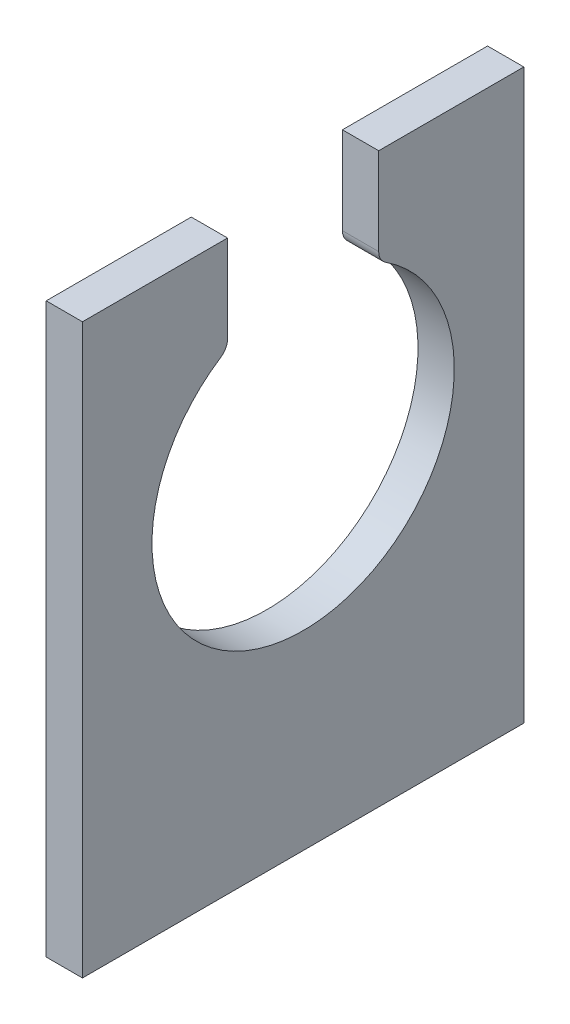
ISO-10303-21;
HEADER;
FILE_DESCRIPTION(('STEP AP214'),'2;1');
FILE_NAME('part.step','',(''),(''),'','','');
FILE_SCHEMA(('AUTOMOTIVE_DESIGN { 1 0 10303 214 1 1 1 1 }'));
ENDSEC;
DATA;
#1=APPLICATION_CONTEXT('core data for automotive mechanical design processes');
#2=APPLICATION_PROTOCOL_DEFINITION('international standard','automotive_design',2000,#1);
#3=PRODUCT_CONTEXT('',#1,'mechanical');
#4=PRODUCT('Part','Part','',(#3));
#5=PRODUCT_RELATED_PRODUCT_CATEGORY('part','',(#4));
#6=PRODUCT_DEFINITION_FORMATION('','',#4);
#7=PRODUCT_DEFINITION_CONTEXT('part definition',#1,'design');
#8=PRODUCT_DEFINITION('design','',#6,#7);
#9=PRODUCT_DEFINITION_SHAPE('','',#8);
#10=(LENGTH_UNIT() NAMED_UNIT(*) SI_UNIT(.MILLI.,.METRE.));
#11=(NAMED_UNIT(*) PLANE_ANGLE_UNIT() SI_UNIT($,.RADIAN.));
#12=(NAMED_UNIT(*) SI_UNIT($,.STERADIAN.) SOLID_ANGLE_UNIT());
#13=UNCERTAINTY_MEASURE_WITH_UNIT(LENGTH_MEASURE(1.E-05),#10,'distance_accuracy_value','');
#14=(GEOMETRIC_REPRESENTATION_CONTEXT(3) GLOBAL_UNCERTAINTY_ASSIGNED_CONTEXT((#13)) GLOBAL_UNIT_ASSIGNED_CONTEXT((#10,
#11,#12)) REPRESENTATION_CONTEXT('',''));
#15=CARTESIAN_POINT('',(0.,0.,0.));
#16=DIRECTION('',(0.,0.,1.));
#17=DIRECTION('',(1.,0.,0.));
#18=AXIS2_PLACEMENT_3D('',#15,#16,#17);
#19=CARTESIAN_POINT('',(12.,94.,73.));
#20=DIRECTION('',(0.,0.,-1.));
#21=DIRECTION('',(0.,1.,0.));
#22=AXIS2_PLACEMENT_3D('',#19,#20,#21);
#23=PLANE('',#22);
#24=DIRECTION('',(0.,-1.,0.));
#25=VECTOR('',#24,1.);
#26=CARTESIAN_POINT('',(0.,94.,73.));
#27=LINE('',#26,#25);
#28=CARTESIAN_POINT('',(0.,94.,73.));
#29=VERTEX_POINT('',#28);
#30=CARTESIAN_POINT('',(0.,-94.,73.));
#31=VERTEX_POINT('',#30);
#32=EDGE_CURVE('E145',#29,#31,#27,.T.);
#33=ORIENTED_EDGE('',*,*,#32,.T.);
#34=DIRECTION('',(-1.,0.,0.));
#35=VECTOR('',#34,1.);
#36=CARTESIAN_POINT('',(12.,-94.,73.));
#37=LINE('',#36,#35);
#38=CARTESIAN_POINT('',(12.,-94.,73.));
#39=VERTEX_POINT('',#38);
#40=EDGE_CURVE('E11',#39,#31,#37,.T.);
#41=ORIENTED_EDGE('',*,*,#40,.F.);
#42=DIRECTION('',(0.,-1.,0.));
#43=VECTOR('',#42,1.);
#44=CARTESIAN_POINT('',(12.,94.,73.));
#45=LINE('',#44,#43);
#46=CARTESIAN_POINT('',(12.,94.,73.));
#47=VERTEX_POINT('',#46);
#48=EDGE_CURVE('E163',#47,#39,#45,.T.);
#49=ORIENTED_EDGE('',*,*,#48,.F.);
#50=DIRECTION('',(-1.,0.,0.));
#51=VECTOR('',#50,1.);
#52=CARTESIAN_POINT('',(12.,94.,73.));
#53=LINE('',#52,#51);
#54=EDGE_CURVE('E141',#47,#29,#53,.T.);
#55=ORIENTED_EDGE('',*,*,#54,.T.);
#56=EDGE_LOOP('',(#33,#41,#49,#55));
#57=FACE_BOUND('',#56,.T.);
#58=ADVANCED_FACE('F37',(#57),#23,.F.);
#59=CARTESIAN_POINT('',(12.,-94.,-73.));
#60=DIRECTION('',(0.,1.,0.));
#61=DIRECTION('',(0.,0.,1.));
#62=AXIS2_PLACEMENT_3D('',#59,#60,#61);
#63=PLANE('',#62);
#64=DIRECTION('',(0.,0.,-1.));
#65=VECTOR('',#64,1.);
#66=CARTESIAN_POINT('',(0.,-94.,-73.));
#67=LINE('',#66,#65);
#68=CARTESIAN_POINT('',(0.,-94.,-73.));
#69=VERTEX_POINT('',#68);
#70=EDGE_CURVE('E148',#31,#69,#67,.T.);
#71=ORIENTED_EDGE('',*,*,#70,.T.);
#72=DIRECTION('',(-1.,0.,0.));
#73=VECTOR('',#72,1.);
#74=CARTESIAN_POINT('',(12.,-94.,-73.));
#75=LINE('',#74,#73);
#76=CARTESIAN_POINT('',(12.,-94.,-73.));
#77=VERTEX_POINT('',#76);
#78=EDGE_CURVE('E45',#77,#69,#75,.T.);
#79=ORIENTED_EDGE('',*,*,#78,.F.);
#80=DIRECTION('',(0.,0.,-1.));
#81=VECTOR('',#80,1.);
#82=CARTESIAN_POINT('',(12.,-94.,-73.));
#83=LINE('',#82,#81);
#84=EDGE_CURVE('E102',#39,#77,#83,.T.);
#85=ORIENTED_EDGE('',*,*,#84,.F.);
#86=ORIENTED_EDGE('',*,*,#40,.T.);
#87=EDGE_LOOP('',(#71,#79,#85,#86));
#88=FACE_BOUND('',#87,.T.);
#89=ADVANCED_FACE('F212',(#88),#63,.F.);
#90=CARTESIAN_POINT('',(12.,94.,-73.));
#91=DIRECTION('',(0.,0.,1.));
#92=DIRECTION('',(0.,-1.,0.));
#93=AXIS2_PLACEMENT_3D('',#90,#91,#92);
#94=PLANE('',#93);
#95=DIRECTION('',(0.,1.,0.));
#96=VECTOR('',#95,1.);
#97=CARTESIAN_POINT('',(0.,94.,-73.));
#98=LINE('',#97,#96);
#99=CARTESIAN_POINT('',(0.,94.,-73.));
#100=VERTEX_POINT('',#99);
#101=EDGE_CURVE('E150',#69,#100,#98,.T.);
#102=ORIENTED_EDGE('',*,*,#101,.T.);
#103=DIRECTION('',(-1.,0.,0.));
#104=VECTOR('',#103,1.);
#105=CARTESIAN_POINT('',(12.,94.,-73.));
#106=LINE('',#105,#104);
#107=CARTESIAN_POINT('',(12.,94.,-73.));
#108=VERTEX_POINT('',#107);
#109=EDGE_CURVE('E176',#108,#100,#106,.T.);
#110=ORIENTED_EDGE('',*,*,#109,.F.);
#111=DIRECTION('',(0.,1.,0.));
#112=VECTOR('',#111,1.);
#113=CARTESIAN_POINT('',(12.,94.,-73.));
#114=LINE('',#113,#112);
#115=EDGE_CURVE('E184',#77,#108,#114,.T.);
#116=ORIENTED_EDGE('',*,*,#115,.F.);
#117=ORIENTED_EDGE('',*,*,#78,.T.);
#118=EDGE_LOOP('',(#102,#110,#116,#117));
#119=FACE_BOUND('',#118,.T.);
#120=ADVANCED_FACE('F182',(#119),#94,.F.);
#121=CARTESIAN_POINT('',(12.,94.,-73.));
#122=DIRECTION('',(0.,-1.,0.));
#123=DIRECTION('',(0.,0.,-1.));
#124=AXIS2_PLACEMENT_3D('',#121,#122,#123);
#125=PLANE('',#124);
#126=DIRECTION('',(0.,0.,1.));
#127=VECTOR('',#126,1.);
#128=CARTESIAN_POINT('',(0.,94.,-73.));
#129=LINE('',#128,#127);
#130=CARTESIAN_POINT('',(0.,94.,-25.));
#131=VERTEX_POINT('',#130);
#132=EDGE_CURVE('E152',#100,#131,#129,.T.);
#133=ORIENTED_EDGE('',*,*,#132,.T.);
#134=DIRECTION('',(-1.,0.,0.));
#135=VECTOR('',#134,1.);
#136=CARTESIAN_POINT('',(12.,94.,-25.));
#137=LINE('',#136,#135);
#138=CARTESIAN_POINT('',(12.,94.,-25.));
#139=VERTEX_POINT('',#138);
#140=EDGE_CURVE('E173',#139,#131,#137,.T.);
#141=ORIENTED_EDGE('',*,*,#140,.F.);
#142=DIRECTION('',(0.,0.,1.));
#143=VECTOR('',#142,1.);
#144=CARTESIAN_POINT('',(12.,94.,-73.));
#145=LINE('',#144,#143);
#146=EDGE_CURVE('E202',#108,#139,#145,.T.);
#147=ORIENTED_EDGE('',*,*,#146,.F.);
#148=ORIENTED_EDGE('',*,*,#109,.T.);
#149=EDGE_LOOP('',(#133,#141,#147,#148));
#150=FACE_BOUND('',#149,.T.);
#151=ADVANCED_FACE('F193',(#150),#125,.F.);
#152=CARTESIAN_POINT('',(12.,94.,-25.));
#153=DIRECTION('',(0.,0.,-1.));
#154=DIRECTION('',(0.,1.,0.));
#155=AXIS2_PLACEMENT_3D('',#152,#153,#154);
#156=PLANE('',#155);
#157=DIRECTION('',(0.,-1.,0.));
#158=VECTOR('',#157,1.);
#159=CARTESIAN_POINT('',(0.,94.,-25.));
#160=LINE('',#159,#158);
#161=CARTESIAN_POINT('',(0.,65.0977222864644,-25.));
#162=VERTEX_POINT('',#161);
#163=EDGE_CURVE('E154',#131,#162,#160,.T.);
#164=ORIENTED_EDGE('',*,*,#163,.T.);
#165=DIRECTION('',(-1.,0.,0.));
#166=VECTOR('',#165,1.);
#167=CARTESIAN_POINT('',(12.,65.0977222864644,-25.));
#168=LINE('',#167,#166);
#169=CARTESIAN_POINT('',(12.,65.0977222864644,-25.));
#170=VERTEX_POINT('',#169);
#171=EDGE_CURVE('E170',#170,#162,#168,.T.);
#172=ORIENTED_EDGE('',*,*,#171,.F.);
#173=DIRECTION('',(0.,-1.,0.));
#174=VECTOR('',#173,1.);
#175=CARTESIAN_POINT('',(12.,94.,-25.));
#176=LINE('',#175,#174);
#177=EDGE_CURVE('E199',#139,#170,#176,.T.);
#178=ORIENTED_EDGE('',*,*,#177,.F.);
#179=ORIENTED_EDGE('',*,*,#140,.T.);
#180=EDGE_LOOP('',(#164,#172,#178,#179));
#181=FACE_BOUND('',#180,.T.);
#182=ADVANCED_FACE('F197',(#181),#156,.F.);
#183=CARTESIAN_POINT('',(12.,65.0977222864644,-30.));
#184=DIRECTION('',(-1.,0.,0.));
#185=DIRECTION('',(0.,0.,1.));
#186=AXIS2_PLACEMENT_3D('',#183,#184,#185);
#187=CYLINDRICAL_SURFACE('',#186,5.);
#188=CARTESIAN_POINT('',(0.,65.0977222864644,-30.));
#189=DIRECTION('',(1.,0.,0.));
#190=DIRECTION('',(0.,0.,-1.));
#191=AXIS2_PLACEMENT_3D('',#188,#189,#190);
#192=CIRCLE('',#191,5.);
#193=CARTESIAN_POINT('',(0.,60.9070202604222,-27.2727272727273));
#194=VERTEX_POINT('',#193);
#195=EDGE_CURVE('E156',#162,#194,#192,.T.);
#196=ORIENTED_EDGE('',*,*,#195,.T.);
#197=DIRECTION('',(-1.,0.,0.));
#198=VECTOR('',#197,1.);
#199=CARTESIAN_POINT('',(12.,60.9070202604222,-27.2727272727273));
#200=LINE('',#199,#198);
#201=CARTESIAN_POINT('',(12.,60.9070202604222,-27.2727272727273));
#202=VERTEX_POINT('',#201);
#203=EDGE_CURVE('E167',#202,#194,#200,.T.);
#204=ORIENTED_EDGE('',*,*,#203,.F.);
#205=CARTESIAN_POINT('',(12.,65.0977222864644,-30.));
#206=DIRECTION('',(1.,0.,0.));
#207=DIRECTION('',(0.,0.,-1.));
#208=AXIS2_PLACEMENT_3D('',#205,#206,#207);
#209=CIRCLE('',#208,5.);
#210=EDGE_CURVE('E201',#170,#202,#209,.T.);
#211=ORIENTED_EDGE('',*,*,#210,.F.);
#212=ORIENTED_EDGE('',*,*,#171,.T.);
#213=EDGE_LOOP('',(#196,#204,#211,#212));
#214=FACE_BOUND('',#213,.T.);
#215=ADVANCED_FACE('F224',(#214),#187,.T.);
#216=CARTESIAN_POINT('',(12.,19.,0.));
#217=DIRECTION('',(-1.,0.,0.));
#218=DIRECTION('',(0.,0.,1.));
#219=AXIS2_PLACEMENT_3D('',#216,#217,#218);
#220=CYLINDRICAL_SURFACE('',#219,50.);
#221=CARTESIAN_POINT('',(0.,19.,0.));
#222=DIRECTION('',(-1.,0.,0.));
#223=DIRECTION('',(0.,0.,-1.));
#224=AXIS2_PLACEMENT_3D('',#221,#222,#223);
#225=CIRCLE('',#224,50.);
#226=CARTESIAN_POINT('',(0.,60.9070202604222,27.2727272727272));
#227=VERTEX_POINT('',#226);
#228=EDGE_CURVE('E158',#194,#227,#225,.T.);
#229=ORIENTED_EDGE('',*,*,#228,.T.);
#230=DIRECTION('',(-1.,0.,0.));
#231=VECTOR('',#230,1.);
#232=CARTESIAN_POINT('',(12.,60.9070202604222,27.2727272727272));
#233=LINE('',#232,#231);
#234=CARTESIAN_POINT('',(12.,60.9070202604222,27.2727272727272));
#235=VERTEX_POINT('',#234);
#236=EDGE_CURVE('E136',#235,#227,#233,.T.);
#237=ORIENTED_EDGE('',*,*,#236,.F.);
#238=CARTESIAN_POINT('',(12.,19.,0.));
#239=DIRECTION('',(-1.,0.,0.));
#240=DIRECTION('',(0.,0.,-1.));
#241=AXIS2_PLACEMENT_3D('',#238,#239,#240);
#242=CIRCLE('',#241,50.);
#243=EDGE_CURVE('E127',#202,#235,#242,.T.);
#244=ORIENTED_EDGE('',*,*,#243,.F.);
#245=ORIENTED_EDGE('',*,*,#203,.T.);
#246=EDGE_LOOP('',(#229,#237,#244,#245));
#247=FACE_BOUND('',#246,.T.);
#248=ADVANCED_FACE('F227',(#247),#220,.F.);
#249=CARTESIAN_POINT('',(12.,65.0977222864644,30.));
#250=DIRECTION('',(-1.,0.,0.));
#251=DIRECTION('',(0.,0.,1.));
#252=AXIS2_PLACEMENT_3D('',#249,#250,#251);
#253=CYLINDRICAL_SURFACE('',#252,5.);
#254=CARTESIAN_POINT('',(0.,65.0977222864644,30.));
#255=DIRECTION('',(1.,0.,0.));
#256=DIRECTION('',(0.,0.,1.));
#257=AXIS2_PLACEMENT_3D('',#254,#255,#256);
#258=CIRCLE('',#257,5.);
#259=CARTESIAN_POINT('',(0.,65.0977222864644,25.));
#260=VERTEX_POINT('',#259);
#261=EDGE_CURVE('E135',#227,#260,#258,.T.);
#262=ORIENTED_EDGE('',*,*,#261,.T.);
#263=DIRECTION('',(-1.,0.,0.));
#264=VECTOR('',#263,1.);
#265=CARTESIAN_POINT('',(12.,65.0977222864644,25.));
#266=LINE('',#265,#264);
#267=CARTESIAN_POINT('',(12.,65.0977222864644,25.));
#268=VERTEX_POINT('',#267);
#269=EDGE_CURVE('E132',#268,#260,#266,.T.);
#270=ORIENTED_EDGE('',*,*,#269,.F.);
#271=CARTESIAN_POINT('',(12.,65.0977222864644,30.));
#272=DIRECTION('',(1.,0.,0.));
#273=DIRECTION('',(0.,0.,1.));
#274=AXIS2_PLACEMENT_3D('',#271,#272,#273);
#275=CIRCLE('',#274,5.);
#276=EDGE_CURVE('E121',#235,#268,#275,.T.);
#277=ORIENTED_EDGE('',*,*,#276,.F.);
#278=ORIENTED_EDGE('',*,*,#236,.T.);
#279=EDGE_LOOP('',(#262,#270,#277,#278));
#280=FACE_BOUND('',#279,.T.);
#281=ADVANCED_FACE('F133',(#280),#253,.T.);
#282=CARTESIAN_POINT('',(12.,94.,25.));
#283=DIRECTION('',(0.,0.,1.));
#284=DIRECTION('',(0.,-1.,0.));
#285=AXIS2_PLACEMENT_3D('',#282,#283,#284);
#286=PLANE('',#285);
#287=DIRECTION('',(0.,1.,0.));
#288=VECTOR('',#287,1.);
#289=CARTESIAN_POINT('',(0.,94.,25.));
#290=LINE('',#289,#288);
#291=CARTESIAN_POINT('',(0.,94.,25.));
#292=VERTEX_POINT('',#291);
#293=EDGE_CURVE('E88',#260,#292,#290,.T.);
#294=ORIENTED_EDGE('',*,*,#293,.T.);
#295=DIRECTION('',(-1.,0.,0.));
#296=VECTOR('',#295,1.);
#297=CARTESIAN_POINT('',(12.,94.,25.));
#298=LINE('',#297,#296);
#299=CARTESIAN_POINT('',(12.,94.,25.));
#300=VERTEX_POINT('',#299);
#301=EDGE_CURVE('E137',#300,#292,#298,.T.);
#302=ORIENTED_EDGE('',*,*,#301,.F.);
#303=DIRECTION('',(0.,1.,0.));
#304=VECTOR('',#303,1.);
#305=CARTESIAN_POINT('',(12.,94.,25.));
#306=LINE('',#305,#304);
#307=EDGE_CURVE('E125',#268,#300,#306,.T.);
#308=ORIENTED_EDGE('',*,*,#307,.F.);
#309=ORIENTED_EDGE('',*,*,#269,.T.);
#310=EDGE_LOOP('',(#294,#302,#308,#309));
#311=FACE_BOUND('',#310,.T.);
#312=ADVANCED_FACE('F139',(#311),#286,.F.);
#313=CARTESIAN_POINT('',(12.,94.,25.));
#314=DIRECTION('',(0.,-1.,0.));
#315=DIRECTION('',(0.,0.,-1.));
#316=AXIS2_PLACEMENT_3D('',#313,#314,#315);
#317=PLANE('',#316);
#318=DIRECTION('',(0.,0.,1.));
#319=VECTOR('',#318,1.);
#320=CARTESIAN_POINT('',(0.,94.,25.));
#321=LINE('',#320,#319);
#322=EDGE_CURVE('E94',#292,#29,#321,.T.);
#323=ORIENTED_EDGE('',*,*,#322,.T.);
#324=ORIENTED_EDGE('',*,*,#54,.F.);
#325=DIRECTION('',(0.,0.,1.));
#326=VECTOR('',#325,1.);
#327=CARTESIAN_POINT('',(12.,94.,25.));
#328=LINE('',#327,#326);
#329=EDGE_CURVE('E53',#300,#47,#328,.T.);
#330=ORIENTED_EDGE('',*,*,#329,.F.);
#331=ORIENTED_EDGE('',*,*,#301,.T.);
#332=EDGE_LOOP('',(#323,#324,#330,#331));
#333=FACE_BOUND('',#332,.T.);
#334=ADVANCED_FACE('F236',(#333),#317,.F.);
#335=CARTESIAN_POINT('',(12.,65.0977222864644,-30.));
#336=DIRECTION('',(1.,0.,0.));
#337=DIRECTION('',(0.,0.,-1.));
#338=AXIS2_PLACEMENT_3D('',#335,#336,#337);
#339=PLANE('',#338);
#340=ORIENTED_EDGE('',*,*,#48,.T.);
#341=ORIENTED_EDGE('',*,*,#84,.T.);
#342=ORIENTED_EDGE('',*,*,#115,.T.);
#343=ORIENTED_EDGE('',*,*,#146,.T.);
#344=ORIENTED_EDGE('',*,*,#177,.T.);
#345=ORIENTED_EDGE('',*,*,#210,.T.);
#346=ORIENTED_EDGE('',*,*,#243,.T.);
#347=ORIENTED_EDGE('',*,*,#276,.T.);
#348=ORIENTED_EDGE('',*,*,#307,.T.);
#349=ORIENTED_EDGE('',*,*,#329,.T.);
#350=EDGE_LOOP('',(#340,#341,#342,#343,#344,#345,#346,#347,#348,#349));
#351=FACE_BOUND('',#350,.T.);
#352=ADVANCED_FACE('F123',(#351),#339,.T.);
#353=CARTESIAN_POINT('',(0.,65.0977222864644,-30.));
#354=DIRECTION('',(1.,0.,0.));
#355=DIRECTION('',(0.,0.,-1.));
#356=AXIS2_PLACEMENT_3D('',#353,#354,#355);
#357=PLANE('',#356);
#358=ORIENTED_EDGE('',*,*,#32,.F.);
#359=ORIENTED_EDGE('',*,*,#322,.F.);
#360=ORIENTED_EDGE('',*,*,#293,.F.);
#361=ORIENTED_EDGE('',*,*,#261,.F.);
#362=ORIENTED_EDGE('',*,*,#228,.F.);
#363=ORIENTED_EDGE('',*,*,#195,.F.);
#364=ORIENTED_EDGE('',*,*,#163,.F.);
#365=ORIENTED_EDGE('',*,*,#132,.F.);
#366=ORIENTED_EDGE('',*,*,#101,.F.);
#367=ORIENTED_EDGE('',*,*,#70,.F.);
#368=EDGE_LOOP('',(#358,#359,#360,#361,#362,#363,#364,#365,#366,#367));
#369=FACE_BOUND('',#368,.T.);
#370=ADVANCED_FACE('F188',(#369),#357,.F.);
#371=CLOSED_SHELL('',(#58,#89,#120,#151,#182,#215,#248,#281,#312,#334,#352,#370));
#372=MANIFOLD_SOLID_BREP('B2',#371);
#373=ADVANCED_BREP_SHAPE_REPRESENTATION('',(#18,#372),#14);
#374=SHAPE_DEFINITION_REPRESENTATION(#9,#373);
ENDSEC;
END-ISO-10303-21;
